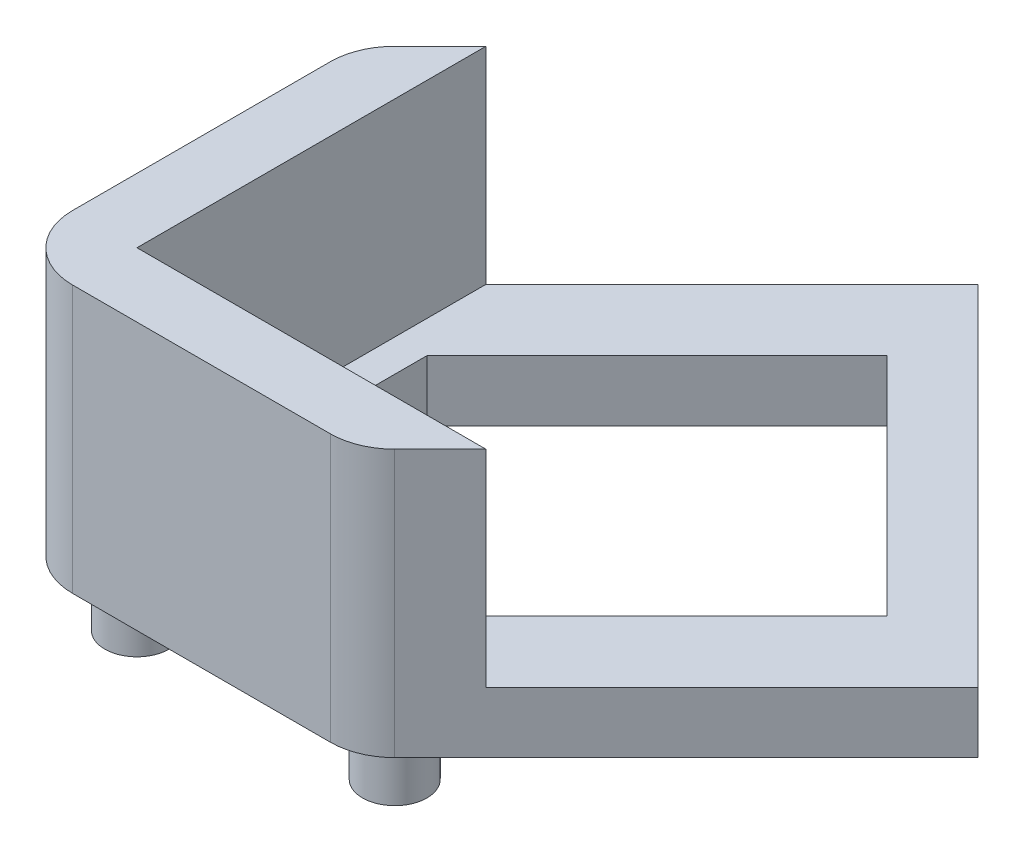
ISO-10303-21;
HEADER;
FILE_DESCRIPTION(('STEP AP214'),'2;1');
FILE_NAME('part.step','',(''),(''),'','','');
FILE_SCHEMA(('AUTOMOTIVE_DESIGN { 1 0 10303 214 1 1 1 1 }'));
ENDSEC;
DATA;
#1=APPLICATION_CONTEXT('core data for automotive mechanical design processes');
#2=APPLICATION_PROTOCOL_DEFINITION('international standard','automotive_design',2000,#1);
#3=PRODUCT_CONTEXT('',#1,'mechanical');
#4=PRODUCT('Part','Part','',(#3));
#5=PRODUCT_RELATED_PRODUCT_CATEGORY('part','',(#4));
#6=PRODUCT_DEFINITION_FORMATION('','',#4);
#7=PRODUCT_DEFINITION_CONTEXT('part definition',#1,'design');
#8=PRODUCT_DEFINITION('design','',#6,#7);
#9=PRODUCT_DEFINITION_SHAPE('','',#8);
#10=(LENGTH_UNIT() NAMED_UNIT(*) SI_UNIT(.MILLI.,.METRE.));
#11=(NAMED_UNIT(*) PLANE_ANGLE_UNIT() SI_UNIT($,.RADIAN.));
#12=(NAMED_UNIT(*) SI_UNIT($,.STERADIAN.) SOLID_ANGLE_UNIT());
#13=UNCERTAINTY_MEASURE_WITH_UNIT(LENGTH_MEASURE(1.E-05),#10,'distance_accuracy_value','');
#14=(GEOMETRIC_REPRESENTATION_CONTEXT(3) GLOBAL_UNCERTAINTY_ASSIGNED_CONTEXT((#13)) GLOBAL_UNIT_ASSIGNED_CONTEXT((#10,
#11,#12)) REPRESENTATION_CONTEXT('',''));
#15=CARTESIAN_POINT('',(0.,0.,0.));
#16=DIRECTION('',(0.,0.,1.));
#17=DIRECTION('',(1.,0.,0.));
#18=AXIS2_PLACEMENT_3D('',#15,#16,#17);
#19=CARTESIAN_POINT('',(-8.59506403026732,3.,-8.59506403026747));
#20=DIRECTION('',(0.707106781186541,0.,0.707106781186554));
#21=DIRECTION('',(0.707106781186554,0.,-0.707106781186541));
#22=AXIS2_PLACEMENT_3D('',#19,#20,#21);
#23=PLANE('',#22);
#24=DIRECTION('',(0.,1.,0.));
#25=VECTOR('',#24,1.);
#26=CARTESIAN_POINT('',(0.,-23.5555762724057,-17.1901280605347));
#27=LINE('',#26,#25);
#28=CARTESIAN_POINT('',(0.,3.,-17.1901280605347));
#29=VERTEX_POINT('',#28);
#30=CARTESIAN_POINT('',(0.,13.16,-17.1901280605347));
#31=VERTEX_POINT('',#30);
#32=EDGE_CURVE('E49',#29,#31,#27,.T.);
#33=ORIENTED_EDGE('',*,*,#32,.F.);
#34=DIRECTION('',(-0.707106781186554,0.,0.707106781186541));
#35=VECTOR('',#34,1.);
#36=CARTESIAN_POINT('',(-8.59506403026732,3.,-8.59506403026747));
#37=LINE('',#36,#35);
#38=CARTESIAN_POINT('',(12.1233457634434,3.,-29.3134738239779));
#39=VERTEX_POINT('',#38);
#40=EDGE_CURVE('E213',#39,#29,#37,.T.);
#41=ORIENTED_EDGE('',*,*,#40,.F.);
#42=DIRECTION('',(0.,-1.,0.));
#43=VECTOR('',#42,1.);
#44=CARTESIAN_POINT('',(12.1233457634434,3.,-29.3134738239779));
#45=LINE('',#44,#43);
#46=CARTESIAN_POINT('',(12.1233457634434,0.,-29.3134738239779));
#47=VERTEX_POINT('',#46);
#48=EDGE_CURVE('E58',#39,#47,#45,.T.);
#49=ORIENTED_EDGE('',*,*,#48,.T.);
#50=DIRECTION('',(-0.707106781186554,0.,0.707106781186541));
#51=VECTOR('',#50,1.);
#52=CARTESIAN_POINT('',(-8.59506403026732,0.,-8.59506403026747));
#53=LINE('',#52,#51);
#54=CARTESIAN_POINT('',(-2.24506403026733,0.,-14.9450640302674));
#55=VERTEX_POINT('',#54);
#56=EDGE_CURVE('E241',#47,#55,#53,.T.);
#57=ORIENTED_EDGE('',*,*,#56,.T.);
#58=DIRECTION('',(0.,-1.,0.));
#59=VECTOR('',#58,1.);
#60=CARTESIAN_POINT('',(-2.24506403026733,3.,-14.9450640302674));
#61=LINE('',#60,#59);
#62=CARTESIAN_POINT('',(-2.2450640302673,13.16,-14.9450640302673));
#63=VERTEX_POINT('',#62);
#64=EDGE_CURVE('E256',#63,#55,#61,.T.);
#65=ORIENTED_EDGE('',*,*,#64,.F.);
#66=DIRECTION('',(-0.707106781186554,0.,0.707106781186541));
#67=VECTOR('',#66,1.);
#68=CARTESIAN_POINT('',(-8.59506403026732,13.16,-8.59506403026747));
#69=LINE('',#68,#67);
#70=EDGE_CURVE('E306',#31,#63,#69,.T.);
#71=ORIENTED_EDGE('',*,*,#70,.F.);
#72=EDGE_LOOP('',(#33,#41,#49,#57,#65,#71));
#73=FACE_BOUND('',#72,.T.);
#74=ADVANCED_FACE('F34',(#73),#23,.F.);
#75=CARTESIAN_POINT('',(0.,3.,-1.58750000000042));
#76=DIRECTION('',(0.,0.,-1.));
#77=DIRECTION('',(-1.,0.,0.));
#78=AXIS2_PLACEMENT_3D('',#75,#76,#77);
#79=PLANE('',#78);
#80=DIRECTION('',(0.,-1.,0.));
#81=VECTOR('',#80,1.);
#82=CARTESIAN_POINT('',(1.5875,3.,-1.5875));
#83=LINE('',#82,#81);
#84=CARTESIAN_POINT('',(1.5875,3.,-1.5875));
#85=VERTEX_POINT('',#84);
#86=CARTESIAN_POINT('',(1.5875,0.,-1.5875));
#87=VERTEX_POINT('',#86);
#88=EDGE_CURVE('E268',#85,#87,#83,.T.);
#89=ORIENTED_EDGE('',*,*,#88,.F.);
#90=DIRECTION('',(1.,0.,0.));
#91=VECTOR('',#90,1.);
#92=CARTESIAN_POINT('',(0.,3.,-1.5875));
#93=LINE('',#92,#91);
#94=CARTESIAN_POINT('',(12.7,3.,-1.5875));
#95=VERTEX_POINT('',#94);
#96=EDGE_CURVE('E294',#85,#95,#93,.T.);
#97=ORIENTED_EDGE('',*,*,#96,.T.);
#98=DIRECTION('',(0.,-1.,0.));
#99=VECTOR('',#98,1.);
#100=CARTESIAN_POINT('',(12.7,3.,-1.58749999999988));
#101=LINE('',#100,#99);
#102=CARTESIAN_POINT('',(12.7,0.,-1.5875));
#103=VERTEX_POINT('',#102);
#104=EDGE_CURVE('E270',#95,#103,#101,.T.);
#105=ORIENTED_EDGE('',*,*,#104,.T.);
#106=DIRECTION('',(1.,0.,0.));
#107=VECTOR('',#106,1.);
#108=CARTESIAN_POINT('',(0.,0.,-1.58750000000042));
#109=LINE('',#108,#107);
#110=EDGE_CURVE('E224',#87,#103,#109,.T.);
#111=ORIENTED_EDGE('',*,*,#110,.F.);
#112=EDGE_LOOP('',(#89,#97,#105,#111));
#113=FACE_BOUND('',#112,.T.);
#114=ADVANCED_FACE('F293',(#113),#79,.T.);
#115=CARTESIAN_POINT('',(1.5875,3.,0.));
#116=DIRECTION('',(1.,0.,0.));
#117=DIRECTION('',(0.,0.,-1.));
#118=AXIS2_PLACEMENT_3D('',#115,#116,#117);
#119=PLANE('',#118);
#120=DIRECTION('',(0.,-1.,0.));
#121=VECTOR('',#120,1.);
#122=CARTESIAN_POINT('',(1.5875,3.,-12.7));
#123=LINE('',#122,#121);
#124=CARTESIAN_POINT('',(1.5875,3.,-12.7));
#125=VERTEX_POINT('',#124);
#126=CARTESIAN_POINT('',(1.5875,0.,-12.7));
#127=VERTEX_POINT('',#126);
#128=EDGE_CURVE('E215',#125,#127,#123,.T.);
#129=ORIENTED_EDGE('',*,*,#128,.F.);
#130=DIRECTION('',(0.,0.,1.));
#131=VECTOR('',#130,1.);
#132=CARTESIAN_POINT('',(1.5875,3.,0.));
#133=LINE('',#132,#131);
#134=EDGE_CURVE('E297',#125,#85,#133,.T.);
#135=ORIENTED_EDGE('',*,*,#134,.T.);
#136=ORIENTED_EDGE('',*,*,#88,.T.);
#137=DIRECTION('',(0.,0.,1.));
#138=VECTOR('',#137,1.);
#139=CARTESIAN_POINT('',(1.5875,0.,0.));
#140=LINE('',#139,#138);
#141=EDGE_CURVE('E226',#127,#87,#140,.T.);
#142=ORIENTED_EDGE('',*,*,#141,.F.);
#143=EDGE_LOOP('',(#129,#135,#136,#142));
#144=FACE_BOUND('',#143,.T.);
#145=ADVANCED_FACE('F352',(#144),#119,.T.);
#146=CARTESIAN_POINT('',(0.,3.,0.));
#147=DIRECTION('',(0.,1.,0.));
#148=DIRECTION('',(0.,0.,1.));
#149=AXIS2_PLACEMENT_3D('',#146,#147,#148);
#150=PLANE('',#149);
#151=DIRECTION('',(-1.,0.,0.));
#152=VECTOR('',#151,1.);
#153=CARTESIAN_POINT('',(0.,3.,0.));
#154=LINE('',#153,#152);
#155=CARTESIAN_POINT('',(17.1901280605346,3.,0.));
#156=VERTEX_POINT('',#155);
#157=CARTESIAN_POINT('',(0.,3.,0.));
#158=VERTEX_POINT('',#157);
#159=EDGE_CURVE('E305',#156,#158,#154,.T.);
#160=ORIENTED_EDGE('',*,*,#159,.F.);
#161=DIRECTION('',(-0.707106781186544,0.,0.707106781186551));
#162=VECTOR('',#161,1.);
#163=CARTESIAN_POINT('',(8.59506403026741,3.,8.59506403026733));
#164=LINE('',#163,#162);
#165=CARTESIAN_POINT('',(29.3134738239779,3.,-12.1233457634434));
#166=VERTEX_POINT('',#165);
#167=EDGE_CURVE('E175',#166,#156,#164,.T.);
#168=ORIENTED_EDGE('',*,*,#167,.F.);
#169=DIRECTION('',(0.707106781186551,0.,0.707106781186544));
#170=VECTOR('',#169,1.);
#171=CARTESIAN_POINT('',(20.7184097937105,3.,-20.7184097937107));
#172=LINE('',#171,#170);
#173=EDGE_CURVE('E211',#39,#166,#172,.T.);
#174=ORIENTED_EDGE('',*,*,#173,.F.);
#175=ORIENTED_EDGE('',*,*,#40,.T.);
#176=DIRECTION('',(0.,0.,1.));
#177=VECTOR('',#176,1.);
#178=CARTESIAN_POINT('',(0.,3.,0.));
#179=LINE('',#178,#177);
#180=EDGE_CURVE('E299',#29,#158,#179,.T.);
#181=ORIENTED_EDGE('',*,*,#180,.T.);
#182=EDGE_LOOP('',(#160,#168,#174,#175,#181));
#183=FACE_BOUND('',#182,.T.);
#184=DIRECTION('',(0.707106781186551,0.,-0.707106781186544));
#185=VECTOR('',#184,1.);
#186=CARTESIAN_POINT('',(5.55625000000001,3.,5.55625000000006));
#187=LINE('',#186,#185);
#188=CARTESIAN_POINT('',(24.0295957634434,3.,-12.9170957634432));
#189=VERTEX_POINT('',#188);
#190=EDGE_CURVE('E207',#95,#189,#187,.T.);
#191=ORIENTED_EDGE('',*,*,#190,.F.);
#192=ORIENTED_EDGE('',*,*,#96,.F.);
#193=ORIENTED_EDGE('',*,*,#134,.F.);
#194=DIRECTION('',(0.707106781186551,0.,-0.707106781186544));
#195=VECTOR('',#194,1.);
#196=CARTESIAN_POINT('',(-5.55625000000001,3.,-5.55625000000007));
#197=LINE('',#196,#195);
#198=CARTESIAN_POINT('',(12.9170957634434,3.,-24.0295957634433));
#199=VERTEX_POINT('',#198);
#200=EDGE_CURVE('E204',#125,#199,#197,.T.);
#201=ORIENTED_EDGE('',*,*,#200,.T.);
#202=DIRECTION('',(0.707106781186543,0.,0.707106781186552));
#203=VECTOR('',#202,1.);
#204=CARTESIAN_POINT('',(18.4733457634434,3.,-18.4733457634432));
#205=LINE('',#204,#203);
#206=EDGE_CURVE('E109',#199,#189,#205,.T.);
#207=ORIENTED_EDGE('',*,*,#206,.T.);
#208=EDGE_LOOP('',(#191,#192,#193,#201,#207));
#209=FACE_BOUND('',#208,.T.);
#210=ADVANCED_FACE('F331',(#183,#209),#150,.T.);
#211=CARTESIAN_POINT('',(0.,3.,3.175));
#212=DIRECTION('',(0.,0.,-1.));
#213=DIRECTION('',(-1.,0.,0.));
#214=AXIS2_PLACEMENT_3D('',#211,#212,#213);
#215=PLANE('',#214);
#216=DIRECTION('',(1.,0.,0.));
#217=VECTOR('',#216,1.);
#218=CARTESIAN_POINT('',(0.,0.,3.175));
#219=LINE('',#218,#217);
#220=CARTESIAN_POINT('',(0.,0.,3.175));
#221=VERTEX_POINT('',#220);
#222=CARTESIAN_POINT('',(12.7,0.,3.175));
#223=VERTEX_POINT('',#222);
#224=EDGE_CURVE('E229',#221,#223,#219,.T.);
#225=ORIENTED_EDGE('',*,*,#224,.T.);
#226=DIRECTION('',(0.,-1.,0.));
#227=VECTOR('',#226,1.);
#228=CARTESIAN_POINT('',(12.7,3.,3.175));
#229=LINE('',#228,#227);
#230=CARTESIAN_POINT('',(12.7,13.16,3.17500000000004));
#231=VERTEX_POINT('',#230);
#232=EDGE_CURVE('E42',#231,#223,#229,.T.);
#233=ORIENTED_EDGE('',*,*,#232,.F.);
#234=DIRECTION('',(1.,0.,0.));
#235=VECTOR('',#234,1.);
#236=CARTESIAN_POINT('',(0.,13.16,3.175));
#237=LINE('',#236,#235);
#238=CARTESIAN_POINT('',(0.,13.16,3.175));
#239=VERTEX_POINT('',#238);
#240=EDGE_CURVE('E188',#239,#231,#237,.T.);
#241=ORIENTED_EDGE('',*,*,#240,.F.);
#242=DIRECTION('',(0.,-1.,0.));
#243=VECTOR('',#242,1.);
#244=CARTESIAN_POINT('',(0.,3.,3.175));
#245=LINE('',#244,#243);
#246=EDGE_CURVE('E248',#239,#221,#245,.T.);
#247=ORIENTED_EDGE('',*,*,#246,.T.);
#248=EDGE_LOOP('',(#225,#233,#241,#247));
#249=FACE_BOUND('',#248,.T.);
#250=ADVANCED_FACE('F344',(#249),#215,.F.);
#251=CARTESIAN_POINT('',(12.7,3.,0.));
#252=DIRECTION('',(0.,-1.,0.));
#253=DIRECTION('',(0.,0.,-1.));
#254=AXIS2_PLACEMENT_3D('',#251,#252,#253);
#255=CYLINDRICAL_SURFACE('',#254,3.17500000000004);
#256=CARTESIAN_POINT('',(12.7,0.,0.));
#257=DIRECTION('',(0.,1.,0.));
#258=DIRECTION('',(0.,0.,1.));
#259=AXIS2_PLACEMENT_3D('',#256,#257,#258);
#260=CIRCLE('',#259,3.17500000000004);
#261=CARTESIAN_POINT('',(14.9450640302674,0.,2.24506403026732));
#262=VERTEX_POINT('',#261);
#263=EDGE_CURVE('E232',#223,#262,#260,.T.);
#264=ORIENTED_EDGE('',*,*,#263,.T.);
#265=DIRECTION('',(0.,-1.,0.));
#266=VECTOR('',#265,1.);
#267=CARTESIAN_POINT('',(14.9450640302674,3.,2.24506403026732));
#268=LINE('',#267,#266);
#269=CARTESIAN_POINT('',(14.9450640302674,13.16,2.24506403026732));
#270=VERTEX_POINT('',#269);
#271=EDGE_CURVE('E262',#270,#262,#268,.T.);
#272=ORIENTED_EDGE('',*,*,#271,.F.);
#273=CARTESIAN_POINT('',(12.7,13.16,0.));
#274=DIRECTION('',(0.,1.,0.));
#275=DIRECTION('',(0.,0.,1.));
#276=AXIS2_PLACEMENT_3D('',#273,#274,#275);
#277=CIRCLE('',#276,3.17500000000004);
#278=EDGE_CURVE('E182',#231,#270,#277,.T.);
#279=ORIENTED_EDGE('',*,*,#278,.F.);
#280=ORIENTED_EDGE('',*,*,#232,.T.);
#281=EDGE_LOOP('',(#264,#272,#279,#280));
#282=FACE_BOUND('',#281,.T.);
#283=ADVANCED_FACE('F323',(#282),#255,.T.);
#284=CARTESIAN_POINT('',(8.59506403026741,3.,8.59506403026733));
#285=DIRECTION('',(0.707106781186551,0.,0.707106781186544));
#286=DIRECTION('',(0.707106781186544,0.,-0.707106781186551));
#287=AXIS2_PLACEMENT_3D('',#284,#285,#286);
#288=PLANE('',#287);
#289=DIRECTION('',(0.,1.,0.));
#290=VECTOR('',#289,1.);
#291=CARTESIAN_POINT('',(17.1901280605346,-23.5555762724057,0.));
#292=LINE('',#291,#290);
#293=CARTESIAN_POINT('',(17.1901280605346,13.16,0.));
#294=VERTEX_POINT('',#293);
#295=EDGE_CURVE('E163',#156,#294,#292,.T.);
#296=ORIENTED_EDGE('',*,*,#295,.T.);
#297=DIRECTION('',(0.707106781186544,0.,-0.707106781186551));
#298=VECTOR('',#297,1.);
#299=CARTESIAN_POINT('',(8.59506403026741,13.16,8.59506403026733));
#300=LINE('',#299,#298);
#301=EDGE_CURVE('E173',#270,#294,#300,.T.);
#302=ORIENTED_EDGE('',*,*,#301,.F.);
#303=ORIENTED_EDGE('',*,*,#271,.T.);
#304=DIRECTION('',(-0.707106781186544,0.,0.707106781186551));
#305=VECTOR('',#304,1.);
#306=CARTESIAN_POINT('',(8.59506403026741,0.,8.59506403026733));
#307=LINE('',#306,#305);
#308=CARTESIAN_POINT('',(29.3134738239779,0.,-12.1233457634434));
#309=VERTEX_POINT('',#308);
#310=EDGE_CURVE('E235',#309,#262,#307,.T.);
#311=ORIENTED_EDGE('',*,*,#310,.F.);
#312=DIRECTION('',(0.,-1.,0.));
#313=VECTOR('',#312,1.);
#314=CARTESIAN_POINT('',(29.3134738239779,3.,-12.1233457634434));
#315=LINE('',#314,#313);
#316=EDGE_CURVE('E260',#166,#309,#315,.T.);
#317=ORIENTED_EDGE('',*,*,#316,.F.);
#318=ORIENTED_EDGE('',*,*,#167,.T.);
#319=EDGE_LOOP('',(#296,#302,#303,#311,#317,#318));
#320=FACE_BOUND('',#319,.T.);
#321=ADVANCED_FACE('F172',(#320),#288,.T.);
#322=CARTESIAN_POINT('',(20.7184097937105,3.,-20.7184097937107));
#323=DIRECTION('',(0.707106781186544,0.,-0.707106781186551));
#324=DIRECTION('',(-0.707106781186551,0.,-0.707106781186544));
#325=AXIS2_PLACEMENT_3D('',#322,#323,#324);
#326=PLANE('',#325);
#327=DIRECTION('',(0.707106781186551,0.,0.707106781186544));
#328=VECTOR('',#327,1.);
#329=CARTESIAN_POINT('',(20.7184097937105,0.,-20.7184097937107));
#330=LINE('',#329,#328);
#331=EDGE_CURVE('E238',#47,#309,#330,.T.);
#332=ORIENTED_EDGE('',*,*,#331,.F.);
#333=ORIENTED_EDGE('',*,*,#48,.F.);
#334=ORIENTED_EDGE('',*,*,#173,.T.);
#335=ORIENTED_EDGE('',*,*,#316,.T.);
#336=EDGE_LOOP('',(#332,#333,#334,#335));
#337=FACE_BOUND('',#336,.T.);
#338=ADVANCED_FACE('F328',(#337),#326,.T.);
#339=CARTESIAN_POINT('',(0.,3.,-12.7));
#340=DIRECTION('',(0.,-1.,0.));
#341=DIRECTION('',(0.,0.,-1.));
#342=AXIS2_PLACEMENT_3D('',#339,#340,#341);
#343=CYLINDRICAL_SURFACE('',#342,3.17500000000004);
#344=CARTESIAN_POINT('',(0.,0.,-12.7));
#345=DIRECTION('',(0.,1.,0.));
#346=DIRECTION('',(0.,0.,1.));
#347=AXIS2_PLACEMENT_3D('',#344,#345,#346);
#348=CIRCLE('',#347,3.17500000000004);
#349=CARTESIAN_POINT('',(-3.175,0.,-12.7));
#350=VERTEX_POINT('',#349);
#351=EDGE_CURVE('E243',#55,#350,#348,.T.);
#352=ORIENTED_EDGE('',*,*,#351,.T.);
#353=DIRECTION('',(0.,-1.,0.));
#354=VECTOR('',#353,1.);
#355=CARTESIAN_POINT('',(-3.175,3.,-12.7));
#356=LINE('',#355,#354);
#357=CARTESIAN_POINT('',(-3.175,13.16,-12.7));
#358=VERTEX_POINT('',#357);
#359=EDGE_CURVE('E253',#358,#350,#356,.T.);
#360=ORIENTED_EDGE('',*,*,#359,.F.);
#361=CARTESIAN_POINT('',(0.,13.16,-12.7));
#362=DIRECTION('',(0.,1.,0.));
#363=DIRECTION('',(0.,0.,1.));
#364=AXIS2_PLACEMENT_3D('',#361,#362,#363);
#365=CIRCLE('',#364,3.17500000000004);
#366=EDGE_CURVE('E311',#63,#358,#365,.T.);
#367=ORIENTED_EDGE('',*,*,#366,.F.);
#368=ORIENTED_EDGE('',*,*,#64,.T.);
#369=EDGE_LOOP('',(#352,#360,#367,#368));
#370=FACE_BOUND('',#369,.T.);
#371=ADVANCED_FACE('F338',(#370),#343,.T.);
#372=CARTESIAN_POINT('',(-3.175,3.,0.));
#373=DIRECTION('',(1.,0.,0.));
#374=DIRECTION('',(0.,0.,-1.));
#375=AXIS2_PLACEMENT_3D('',#372,#373,#374);
#376=PLANE('',#375);
#377=DIRECTION('',(0.,0.,1.));
#378=VECTOR('',#377,1.);
#379=CARTESIAN_POINT('',(-3.175,0.,0.));
#380=LINE('',#379,#378);
#381=CARTESIAN_POINT('',(-3.175,0.,0.));
#382=VERTEX_POINT('',#381);
#383=EDGE_CURVE('E245',#350,#382,#380,.T.);
#384=ORIENTED_EDGE('',*,*,#383,.T.);
#385=DIRECTION('',(0.,-1.,0.));
#386=VECTOR('',#385,1.);
#387=CARTESIAN_POINT('',(-3.175,3.,0.));
#388=LINE('',#387,#386);
#389=CARTESIAN_POINT('',(-3.175,13.16,0.));
#390=VERTEX_POINT('',#389);
#391=EDGE_CURVE('E250',#390,#382,#388,.T.);
#392=ORIENTED_EDGE('',*,*,#391,.F.);
#393=DIRECTION('',(0.,0.,1.));
#394=VECTOR('',#393,1.);
#395=CARTESIAN_POINT('',(-3.175,13.16,0.));
#396=LINE('',#395,#394);
#397=EDGE_CURVE('E314',#358,#390,#396,.T.);
#398=ORIENTED_EDGE('',*,*,#397,.F.);
#399=ORIENTED_EDGE('',*,*,#359,.T.);
#400=EDGE_LOOP('',(#384,#392,#398,#399));
#401=FACE_BOUND('',#400,.T.);
#402=ADVANCED_FACE('F341',(#401),#376,.F.);
#403=CARTESIAN_POINT('',(-5.55625000000001,3.,-5.55625000000007));
#404=DIRECTION('',(-0.707106781186544,0.,-0.707106781186551));
#405=DIRECTION('',(-0.707106781186551,0.,0.707106781186544));
#406=AXIS2_PLACEMENT_3D('',#403,#404,#405);
#407=PLANE('',#406);
#408=DIRECTION('',(0.707106781186551,0.,-0.707106781186544));
#409=VECTOR('',#408,1.);
#410=CARTESIAN_POINT('',(-5.55625000000001,0.,-5.55625000000007));
#411=LINE('',#410,#409);
#412=CARTESIAN_POINT('',(12.9170957634434,0.,-24.0295957634433));
#413=VERTEX_POINT('',#412);
#414=EDGE_CURVE('E203',#127,#413,#411,.T.);
#415=ORIENTED_EDGE('',*,*,#414,.T.);
#416=DIRECTION('',(0.,-1.,0.));
#417=VECTOR('',#416,1.);
#418=CARTESIAN_POINT('',(12.9170957634434,3.,-24.0295957634433));
#419=LINE('',#418,#417);
#420=EDGE_CURVE('E251',#199,#413,#419,.T.);
#421=ORIENTED_EDGE('',*,*,#420,.F.);
#422=ORIENTED_EDGE('',*,*,#200,.F.);
#423=ORIENTED_EDGE('',*,*,#128,.T.);
#424=EDGE_LOOP('',(#415,#421,#422,#423));
#425=FACE_BOUND('',#424,.T.);
#426=ADVANCED_FACE('F36',(#425),#407,.F.);
#427=CARTESIAN_POINT('',(18.4733457634434,3.,-18.4733457634432));
#428=DIRECTION('',(0.707106781186552,0.,-0.707106781186543));
#429=DIRECTION('',(-0.707106781186543,0.,-0.707106781186552));
#430=AXIS2_PLACEMENT_3D('',#427,#428,#429);
#431=PLANE('',#430);
#432=DIRECTION('',(0.707106781186543,0.,0.707106781186552));
#433=VECTOR('',#432,1.);
#434=CARTESIAN_POINT('',(18.4733457634434,0.,-18.4733457634432));
#435=LINE('',#434,#433);
#436=CARTESIAN_POINT('',(24.0295957634434,0.,-12.9170957634432));
#437=VERTEX_POINT('',#436);
#438=EDGE_CURVE('E218',#413,#437,#435,.T.);
#439=ORIENTED_EDGE('',*,*,#438,.T.);
#440=DIRECTION('',(0.,-1.,0.));
#441=VECTOR('',#440,1.);
#442=CARTESIAN_POINT('',(24.0295957634434,3.,-12.9170957634432));
#443=LINE('',#442,#441);
#444=EDGE_CURVE('E273',#189,#437,#443,.T.);
#445=ORIENTED_EDGE('',*,*,#444,.F.);
#446=ORIENTED_EDGE('',*,*,#206,.F.);
#447=ORIENTED_EDGE('',*,*,#420,.T.);
#448=EDGE_LOOP('',(#439,#445,#446,#447));
#449=FACE_BOUND('',#448,.T.);
#450=ADVANCED_FACE('F275',(#449),#431,.F.);
#451=CARTESIAN_POINT('',(5.55625000000001,3.,5.55625000000006));
#452=DIRECTION('',(-0.707106781186544,0.,-0.707106781186551));
#453=DIRECTION('',(-0.707106781186551,0.,0.707106781186544));
#454=AXIS2_PLACEMENT_3D('',#451,#452,#453);
#455=PLANE('',#454);
#456=DIRECTION('',(0.707106781186551,0.,-0.707106781186544));
#457=VECTOR('',#456,1.);
#458=CARTESIAN_POINT('',(5.55625000000001,0.,5.55625000000006));
#459=LINE('',#458,#457);
#460=EDGE_CURVE('E221',#103,#437,#459,.T.);
#461=ORIENTED_EDGE('',*,*,#460,.F.);
#462=ORIENTED_EDGE('',*,*,#104,.F.);
#463=ORIENTED_EDGE('',*,*,#190,.T.);
#464=ORIENTED_EDGE('',*,*,#444,.T.);
#465=EDGE_LOOP('',(#461,#462,#463,#464));
#466=FACE_BOUND('',#465,.T.);
#467=ADVANCED_FACE('F288',(#466),#455,.T.);
#468=CARTESIAN_POINT('',(0.,3.,0.));
#469=DIRECTION('',(0.,-1.,0.));
#470=DIRECTION('',(0.,0.,-1.));
#471=AXIS2_PLACEMENT_3D('',#468,#469,#470);
#472=CYLINDRICAL_SURFACE('',#471,3.175);
#473=CARTESIAN_POINT('',(0.,0.,0.));
#474=DIRECTION('',(0.,1.,0.));
#475=DIRECTION('',(0.,0.,1.));
#476=AXIS2_PLACEMENT_3D('',#473,#474,#475);
#477=CIRCLE('',#476,3.175);
#478=EDGE_CURVE('E101',#382,#221,#477,.T.);
#479=ORIENTED_EDGE('',*,*,#478,.T.);
#480=ORIENTED_EDGE('',*,*,#246,.F.);
#481=CARTESIAN_POINT('',(0.,13.16,0.));
#482=DIRECTION('',(0.,1.,0.));
#483=DIRECTION('',(0.,0.,1.));
#484=AXIS2_PLACEMENT_3D('',#481,#482,#483);
#485=CIRCLE('',#484,3.175);
#486=EDGE_CURVE('E317',#390,#239,#485,.T.);
#487=ORIENTED_EDGE('',*,*,#486,.F.);
#488=ORIENTED_EDGE('',*,*,#391,.T.);
#489=EDGE_LOOP('',(#479,#480,#487,#488));
#490=FACE_BOUND('',#489,.T.);
#491=ADVANCED_FACE('F343',(#490),#472,.T.);
#492=CARTESIAN_POINT('',(0.,0.,0.));
#493=DIRECTION('',(0.,1.,0.));
#494=DIRECTION('',(0.,0.,1.));
#495=AXIS2_PLACEMENT_3D('',#492,#493,#494);
#496=PLANE('',#495);
#497=CARTESIAN_POINT('',(0.,0.,0.));
#498=DIRECTION('',(0.,1.,0.));
#499=DIRECTION('',(0.,0.,1.));
#500=AXIS2_PLACEMENT_3D('',#497,#498,#499);
#501=CIRCLE('',#500,1.5875);
#502=CARTESIAN_POINT('',(0.,0.,1.5875));
#503=VERTEX_POINT('',#502);
#504=EDGE_CURVE('E11',#503,#503,#501,.F.);
#505=ORIENTED_EDGE('',*,*,#504,.F.);
#506=EDGE_LOOP('',(#505));
#507=FACE_BOUND('',#506,.T.);
#508=ORIENTED_EDGE('',*,*,#414,.F.);
#509=CARTESIAN_POINT('',(0.,0.,-12.7));
#510=DIRECTION('',(0.,-1.,0.));
#511=DIRECTION('',(0.,0.,-1.));
#512=AXIS2_PLACEMENT_3D('',#509,#510,#511);
#513=CIRCLE('',#512,1.5875);
#514=EDGE_CURVE('E183',#127,#127,#513,.T.);
#515=ORIENTED_EDGE('',*,*,#514,.F.);
#516=ORIENTED_EDGE('',*,*,#141,.T.);
#517=ORIENTED_EDGE('',*,*,#110,.T.);
#518=CARTESIAN_POINT('',(12.7,0.,0.));
#519=DIRECTION('',(0.,-1.,0.));
#520=DIRECTION('',(0.,0.,-1.));
#521=AXIS2_PLACEMENT_3D('',#518,#519,#520);
#522=CIRCLE('',#521,1.5875);
#523=EDGE_CURVE('E193',#103,#103,#522,.T.);
#524=ORIENTED_EDGE('',*,*,#523,.F.);
#525=ORIENTED_EDGE('',*,*,#460,.T.);
#526=ORIENTED_EDGE('',*,*,#438,.F.);
#527=EDGE_LOOP('',(#508,#515,#516,#517,#524,#525,#526));
#528=FACE_BOUND('',#527,.T.);
#529=ORIENTED_EDGE('',*,*,#224,.F.);
#530=ORIENTED_EDGE('',*,*,#478,.F.);
#531=ORIENTED_EDGE('',*,*,#383,.F.);
#532=ORIENTED_EDGE('',*,*,#351,.F.);
#533=ORIENTED_EDGE('',*,*,#56,.F.);
#534=ORIENTED_EDGE('',*,*,#331,.T.);
#535=ORIENTED_EDGE('',*,*,#310,.T.);
#536=ORIENTED_EDGE('',*,*,#263,.F.);
#537=EDGE_LOOP('',(#529,#530,#531,#532,#533,#534,#535,#536));
#538=FACE_BOUND('',#537,.T.);
#539=ADVANCED_FACE('F282',(#507,#528,#538),#496,.F.);
#540=CARTESIAN_POINT('',(0.,-3.175,0.));
#541=DIRECTION('',(0.,1.,0.));
#542=DIRECTION('',(0.,0.,1.));
#543=AXIS2_PLACEMENT_3D('',#540,#541,#542);
#544=CYLINDRICAL_SURFACE('',#543,1.5875);
#545=CARTESIAN_POINT('',(0.,-3.175,0.));
#546=DIRECTION('',(0.,-1.,0.));
#547=DIRECTION('',(0.,0.,-1.));
#548=AXIS2_PLACEMENT_3D('',#545,#546,#547);
#549=CIRCLE('',#548,1.5875);
#550=CARTESIAN_POINT('',(0.,-3.175,-1.5875));
#551=VERTEX_POINT('',#550);
#552=EDGE_CURVE('E198',#551,#551,#549,.T.);
#553=ORIENTED_EDGE('',*,*,#552,.F.);
#554=EDGE_LOOP('',(#553));
#555=FACE_BOUND('',#554,.T.);
#556=ORIENTED_EDGE('',*,*,#504,.T.);
#557=EDGE_LOOP('',(#556));
#558=FACE_BOUND('',#557,.T.);
#559=ADVANCED_FACE('F415',(#555,#558),#544,.T.);
#560=CARTESIAN_POINT('',(0.,-3.175,0.));
#561=DIRECTION('',(0.,-1.,0.));
#562=DIRECTION('',(0.,0.,-1.));
#563=AXIS2_PLACEMENT_3D('',#560,#561,#562);
#564=PLANE('',#563);
#565=ORIENTED_EDGE('',*,*,#552,.T.);
#566=EDGE_LOOP('',(#565));
#567=FACE_BOUND('',#566,.T.);
#568=ADVANCED_FACE('F423',(#567),#564,.T.);
#569=CARTESIAN_POINT('',(12.7,-3.175,0.));
#570=DIRECTION('',(0.,1.,0.));
#571=DIRECTION('',(0.,0.,1.));
#572=AXIS2_PLACEMENT_3D('',#569,#570,#571);
#573=CYLINDRICAL_SURFACE('',#572,1.5875);
#574=CARTESIAN_POINT('',(12.7,-3.175,0.));
#575=DIRECTION('',(0.,-1.,0.));
#576=DIRECTION('',(0.,0.,-1.));
#577=AXIS2_PLACEMENT_3D('',#574,#575,#576);
#578=CIRCLE('',#577,1.5875);
#579=CARTESIAN_POINT('',(12.7,-3.175,-1.5875));
#580=VERTEX_POINT('',#579);
#581=EDGE_CURVE('E195',#580,#580,#578,.T.);
#582=ORIENTED_EDGE('',*,*,#581,.F.);
#583=EDGE_LOOP('',(#582));
#584=FACE_BOUND('',#583,.T.);
#585=ORIENTED_EDGE('',*,*,#523,.T.);
#586=EDGE_LOOP('',(#585));
#587=FACE_BOUND('',#586,.T.);
#588=ADVANCED_FACE('F431',(#584,#587),#573,.T.);
#589=CARTESIAN_POINT('',(12.7,-3.175,0.));
#590=DIRECTION('',(0.,-1.,0.));
#591=DIRECTION('',(0.,0.,-1.));
#592=AXIS2_PLACEMENT_3D('',#589,#590,#591);
#593=PLANE('',#592);
#594=ORIENTED_EDGE('',*,*,#581,.T.);
#595=EDGE_LOOP('',(#594));
#596=FACE_BOUND('',#595,.T.);
#597=ADVANCED_FACE('F439',(#596),#593,.T.);
#598=CARTESIAN_POINT('',(0.,-3.175,-12.7));
#599=DIRECTION('',(0.,1.,0.));
#600=DIRECTION('',(0.,0.,1.));
#601=AXIS2_PLACEMENT_3D('',#598,#599,#600);
#602=CYLINDRICAL_SURFACE('',#601,1.5875);
#603=CARTESIAN_POINT('',(0.,-3.175,-12.7));
#604=DIRECTION('',(0.,-1.,0.));
#605=DIRECTION('',(0.,0.,-1.));
#606=AXIS2_PLACEMENT_3D('',#603,#604,#605);
#607=CIRCLE('',#606,1.5875);
#608=CARTESIAN_POINT('',(0.,-3.175,-14.2875));
#609=VERTEX_POINT('',#608);
#610=EDGE_CURVE('E186',#609,#609,#607,.T.);
#611=ORIENTED_EDGE('',*,*,#610,.F.);
#612=EDGE_LOOP('',(#611));
#613=FACE_BOUND('',#612,.T.);
#614=ORIENTED_EDGE('',*,*,#514,.T.);
#615=EDGE_LOOP('',(#614));
#616=FACE_BOUND('',#615,.T.);
#617=ADVANCED_FACE('F447',(#613,#616),#602,.T.);
#618=CARTESIAN_POINT('',(0.,-3.175,-12.7));
#619=DIRECTION('',(0.,-1.,0.));
#620=DIRECTION('',(0.,0.,-1.));
#621=AXIS2_PLACEMENT_3D('',#618,#619,#620);
#622=PLANE('',#621);
#623=ORIENTED_EDGE('',*,*,#610,.T.);
#624=EDGE_LOOP('',(#623));
#625=FACE_BOUND('',#624,.T.);
#626=ADVANCED_FACE('F455',(#625),#622,.T.);
#627=CARTESIAN_POINT('',(0.,13.16,0.));
#628=DIRECTION('',(0.,1.,0.));
#629=DIRECTION('',(0.,0.,1.));
#630=AXIS2_PLACEMENT_3D('',#627,#628,#629);
#631=PLANE('',#630);
#632=DIRECTION('',(1.,0.,0.));
#633=VECTOR('',#632,1.);
#634=CARTESIAN_POINT('',(0.,13.16,0.));
#635=LINE('',#634,#633);
#636=CARTESIAN_POINT('',(0.,13.16,0.));
#637=VERTEX_POINT('',#636);
#638=EDGE_CURVE('E160',#637,#294,#635,.T.);
#639=ORIENTED_EDGE('',*,*,#638,.F.);
#640=DIRECTION('',(0.,0.,-1.));
#641=VECTOR('',#640,1.);
#642=CARTESIAN_POINT('',(0.,13.16,0.));
#643=LINE('',#642,#641);
#644=EDGE_CURVE('E168',#637,#31,#643,.T.);
#645=ORIENTED_EDGE('',*,*,#644,.T.);
#646=ORIENTED_EDGE('',*,*,#70,.T.);
#647=ORIENTED_EDGE('',*,*,#366,.T.);
#648=ORIENTED_EDGE('',*,*,#397,.T.);
#649=ORIENTED_EDGE('',*,*,#486,.T.);
#650=ORIENTED_EDGE('',*,*,#240,.T.);
#651=ORIENTED_EDGE('',*,*,#278,.T.);
#652=ORIENTED_EDGE('',*,*,#301,.T.);
#653=EDGE_LOOP('',(#639,#645,#646,#647,#648,#649,#650,#651,#652));
#654=FACE_BOUND('',#653,.T.);
#655=ADVANCED_FACE('F179',(#654),#631,.T.);
#656=CARTESIAN_POINT('',(0.,-23.5555762724057,0.));
#657=DIRECTION('',(0.,0.,1.));
#658=DIRECTION('',(1.,0.,0.));
#659=AXIS2_PLACEMENT_3D('',#656,#657,#658);
#660=PLANE('',#659);
#661=ORIENTED_EDGE('',*,*,#159,.T.);
#662=DIRECTION('',(0.,1.,0.));
#663=VECTOR('',#662,1.);
#664=CARTESIAN_POINT('',(0.,-23.5555762724057,0.));
#665=LINE('',#664,#663);
#666=EDGE_CURVE('E165',#158,#637,#665,.T.);
#667=ORIENTED_EDGE('',*,*,#666,.T.);
#668=ORIENTED_EDGE('',*,*,#638,.T.);
#669=ORIENTED_EDGE('',*,*,#295,.F.);
#670=EDGE_LOOP('',(#661,#667,#668,#669));
#671=FACE_BOUND('',#670,.T.);
#672=ADVANCED_FACE('F162',(#671),#660,.F.);
#673=CARTESIAN_POINT('',(0.,-23.5555762724057,0.));
#674=DIRECTION('',(1.,0.,0.));
#675=DIRECTION('',(0.,0.,-1.));
#676=AXIS2_PLACEMENT_3D('',#673,#674,#675);
#677=PLANE('',#676);
#678=ORIENTED_EDGE('',*,*,#32,.T.);
#679=ORIENTED_EDGE('',*,*,#644,.F.);
#680=ORIENTED_EDGE('',*,*,#666,.F.);
#681=ORIENTED_EDGE('',*,*,#180,.F.);
#682=EDGE_LOOP('',(#678,#679,#680,#681));
#683=FACE_BOUND('',#682,.T.);
#684=ADVANCED_FACE('F332',(#683),#677,.T.);
#685=CLOSED_SHELL('',(#74,#114,#145,#210,#250,#283,#321,#338,#371,#402,#426,#450,#467,#491,#539,
#559,#568,#588,#597,#617,#626,#655,#672,#684));
#686=MANIFOLD_SOLID_BREP('B2',#685);
#687=ADVANCED_BREP_SHAPE_REPRESENTATION('',(#18,#686),#14);
#688=SHAPE_DEFINITION_REPRESENTATION(#9,#687);
ENDSEC;
END-ISO-10303-21;
